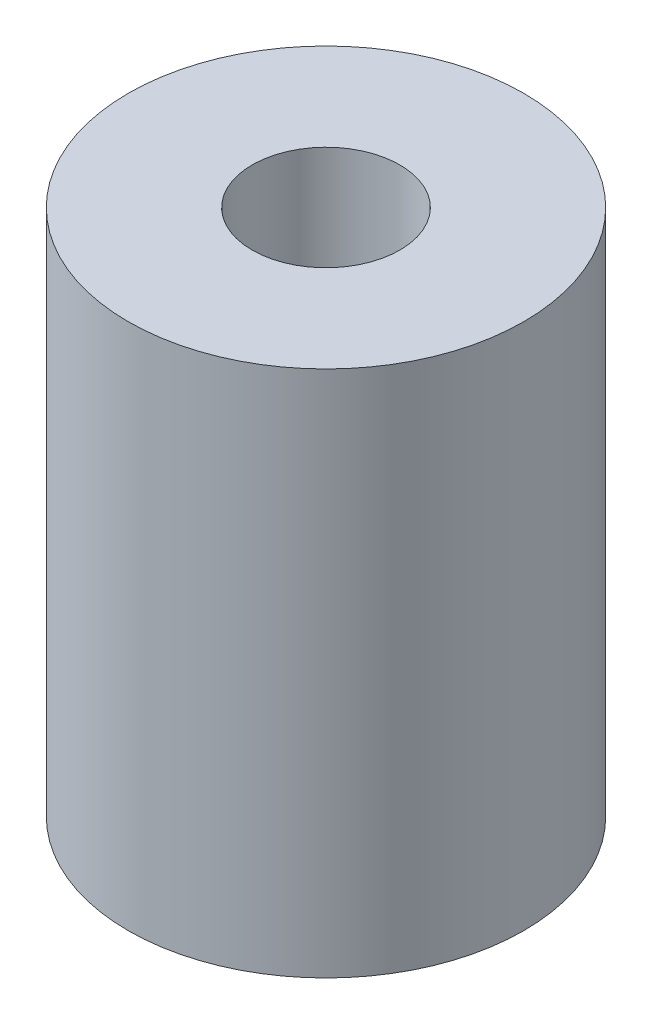
ISO-10303-21;
HEADER;
FILE_DESCRIPTION(('STEP AP214'),'2;1');
FILE_NAME('part.step','',(''),(''),'','','');
FILE_SCHEMA(('AUTOMOTIVE_DESIGN { 1 0 10303 214 1 1 1 1 }'));
ENDSEC;
DATA;
#1=APPLICATION_CONTEXT('core data for automotive mechanical design processes');
#2=APPLICATION_PROTOCOL_DEFINITION('international standard','automotive_design',2000,#1);
#3=PRODUCT_CONTEXT('',#1,'mechanical');
#4=PRODUCT('Part','Part','',(#3));
#5=PRODUCT_RELATED_PRODUCT_CATEGORY('part','',(#4));
#6=PRODUCT_DEFINITION_FORMATION('','',#4);
#7=PRODUCT_DEFINITION_CONTEXT('part definition',#1,'design');
#8=PRODUCT_DEFINITION('design','',#6,#7);
#9=PRODUCT_DEFINITION_SHAPE('','',#8);
#10=(LENGTH_UNIT() NAMED_UNIT(*) SI_UNIT(.MILLI.,.METRE.));
#11=(NAMED_UNIT(*) PLANE_ANGLE_UNIT() SI_UNIT($,.RADIAN.));
#12=(NAMED_UNIT(*) SI_UNIT($,.STERADIAN.) SOLID_ANGLE_UNIT());
#13=UNCERTAINTY_MEASURE_WITH_UNIT(LENGTH_MEASURE(1.E-05),#10,'distance_accuracy_value','');
#14=(GEOMETRIC_REPRESENTATION_CONTEXT(3) GLOBAL_UNCERTAINTY_ASSIGNED_CONTEXT((#13)) GLOBAL_UNIT_ASSIGNED_CONTEXT((#10,
#11,#12)) REPRESENTATION_CONTEXT('',''));
#15=CARTESIAN_POINT('',(0.,0.,0.));
#16=DIRECTION('',(0.,0.,1.));
#17=DIRECTION('',(1.,0.,0.));
#18=AXIS2_PLACEMENT_3D('',#15,#16,#17);
#19=CARTESIAN_POINT('',(0.,20.,0.));
#20=DIRECTION('',(0.,1.,0.));
#21=DIRECTION('',(0.,0.,1.));
#22=AXIS2_PLACEMENT_3D('',#19,#20,#21);
#23=PLANE('',#22);
#24=CARTESIAN_POINT('',(0.,20.,0.));
#25=DIRECTION('',(0.,1.,0.));
#26=DIRECTION('',(0.,0.,1.));
#27=AXIS2_PLACEMENT_3D('',#24,#25,#26);
#28=CIRCLE('',#27,7.5);
#29=CARTESIAN_POINT('',(0.,20.,7.5));
#30=VERTEX_POINT('',#29);
#31=EDGE_CURVE('E10',#30,#30,#28,.T.);
#32=ORIENTED_EDGE('',*,*,#31,.T.);
#33=EDGE_LOOP('',(#32));
#34=FACE_BOUND('',#33,.T.);
#35=CARTESIAN_POINT('',(0.,20.,0.));
#36=DIRECTION('',(0.,1.,0.));
#37=DIRECTION('',(0.,0.,1.));
#38=AXIS2_PLACEMENT_3D('',#35,#36,#37);
#39=CIRCLE('',#38,2.8);
#40=CARTESIAN_POINT('',(0.,20.,2.8));
#41=VERTEX_POINT('',#40);
#42=EDGE_CURVE('E45',#41,#41,#39,.T.);
#43=ORIENTED_EDGE('',*,*,#42,.F.);
#44=EDGE_LOOP('',(#43));
#45=FACE_BOUND('',#44,.T.);
#46=ADVANCED_FACE('F34',(#34,#45),#23,.T.);
#47=CARTESIAN_POINT('',(0.,0.,0.));
#48=DIRECTION('',(0.,1.,0.));
#49=DIRECTION('',(0.,0.,1.));
#50=AXIS2_PLACEMENT_3D('',#47,#48,#49);
#51=PLANE('',#50);
#52=CARTESIAN_POINT('',(0.,0.,0.));
#53=DIRECTION('',(0.,1.,0.));
#54=DIRECTION('',(0.,0.,1.));
#55=AXIS2_PLACEMENT_3D('',#52,#53,#54);
#56=CIRCLE('',#55,7.5);
#57=CARTESIAN_POINT('',(0.,0.,7.5));
#58=VERTEX_POINT('',#57);
#59=EDGE_CURVE('E38',#58,#58,#56,.T.);
#60=ORIENTED_EDGE('',*,*,#59,.F.);
#61=EDGE_LOOP('',(#60));
#62=FACE_BOUND('',#61,.T.);
#63=CARTESIAN_POINT('',(0.,0.,0.));
#64=DIRECTION('',(0.,1.,0.));
#65=DIRECTION('',(0.,0.,1.));
#66=AXIS2_PLACEMENT_3D('',#63,#64,#65);
#67=CIRCLE('',#66,2.8);
#68=CARTESIAN_POINT('',(0.,0.,2.8));
#69=VERTEX_POINT('',#68);
#70=EDGE_CURVE('E47',#69,#69,#67,.T.);
#71=ORIENTED_EDGE('',*,*,#70,.T.);
#72=EDGE_LOOP('',(#71));
#73=FACE_BOUND('',#72,.T.);
#74=ADVANCED_FACE('F57',(#62,#73),#51,.F.);
#75=CARTESIAN_POINT('',(0.,20.,0.));
#76=DIRECTION('',(0.,-1.,0.));
#77=DIRECTION('',(0.,0.,-1.));
#78=AXIS2_PLACEMENT_3D('',#75,#76,#77);
#79=CYLINDRICAL_SURFACE('',#78,7.5);
#80=ORIENTED_EDGE('',*,*,#31,.F.);
#81=EDGE_LOOP('',(#80));
#82=FACE_BOUND('',#81,.T.);
#83=ORIENTED_EDGE('',*,*,#59,.T.);
#84=EDGE_LOOP('',(#83));
#85=FACE_BOUND('',#84,.T.);
#86=ADVANCED_FACE('F36',(#82,#85),#79,.T.);
#87=CARTESIAN_POINT('',(0.,20.,0.));
#88=DIRECTION('',(0.,-1.,0.));
#89=DIRECTION('',(0.,0.,-1.));
#90=AXIS2_PLACEMENT_3D('',#87,#88,#89);
#91=CYLINDRICAL_SURFACE('',#90,2.8);
#92=ORIENTED_EDGE('',*,*,#42,.T.);
#93=EDGE_LOOP('',(#92));
#94=FACE_BOUND('',#93,.T.);
#95=ORIENTED_EDGE('',*,*,#70,.F.);
#96=EDGE_LOOP('',(#95));
#97=FACE_BOUND('',#96,.T.);
#98=ADVANCED_FACE('F53',(#94,#97),#91,.F.);
#99=CLOSED_SHELL('',(#46,#74,#86,#98));
#100=MANIFOLD_SOLID_BREP('B2',#99);
#101=ADVANCED_BREP_SHAPE_REPRESENTATION('',(#18,#100),#14);
#102=SHAPE_DEFINITION_REPRESENTATION(#9,#101);
ENDSEC;
END-ISO-10303-21;
